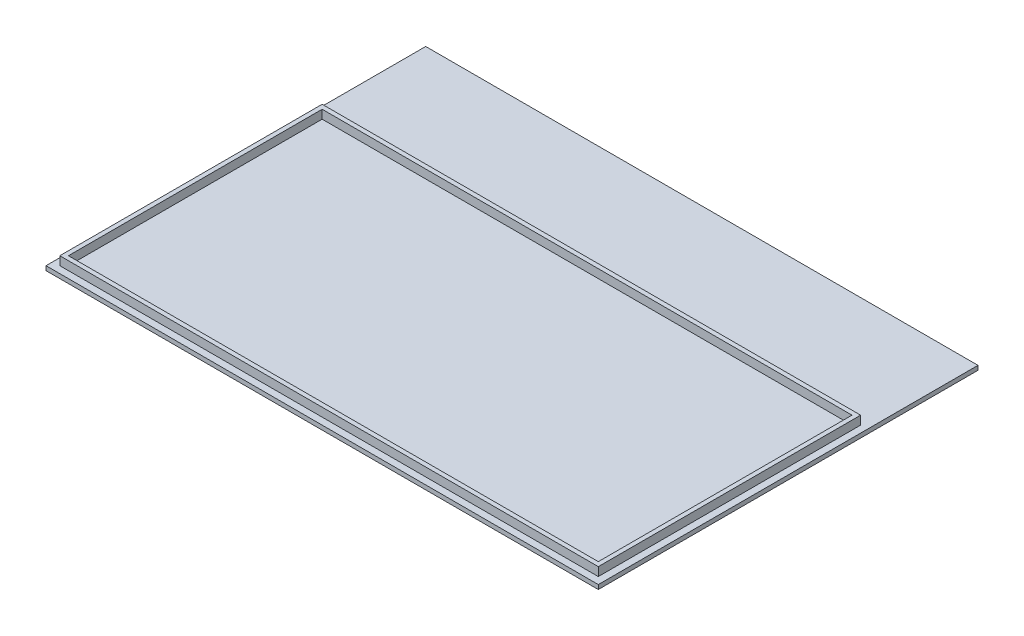
ISO-10303-21;
HEADER;
FILE_DESCRIPTION(('STEP AP214'),'2;1');
FILE_NAME('part.step','',(''),(''),'','','');
FILE_SCHEMA(('AUTOMOTIVE_DESIGN { 1 0 10303 214 1 1 1 1 }'));
ENDSEC;
DATA;
#1=APPLICATION_CONTEXT('core data for automotive mechanical design processes');
#2=APPLICATION_PROTOCOL_DEFINITION('international standard','automotive_design',2000,#1);
#3=PRODUCT_CONTEXT('',#1,'mechanical');
#4=PRODUCT('Part','Part','',(#3));
#5=PRODUCT_RELATED_PRODUCT_CATEGORY('part','',(#4));
#6=PRODUCT_DEFINITION_FORMATION('','',#4);
#7=PRODUCT_DEFINITION_CONTEXT('part definition',#1,'design');
#8=PRODUCT_DEFINITION('design','',#6,#7);
#9=PRODUCT_DEFINITION_SHAPE('','',#8);
#10=(LENGTH_UNIT() NAMED_UNIT(*) SI_UNIT(.MILLI.,.METRE.));
#11=(NAMED_UNIT(*) PLANE_ANGLE_UNIT() SI_UNIT($,.RADIAN.));
#12=(NAMED_UNIT(*) SI_UNIT($,.STERADIAN.) SOLID_ANGLE_UNIT());
#13=UNCERTAINTY_MEASURE_WITH_UNIT(LENGTH_MEASURE(1.E-05),#10,'distance_accuracy_value','');
#14=(GEOMETRIC_REPRESENTATION_CONTEXT(3) GLOBAL_UNCERTAINTY_ASSIGNED_CONTEXT((#13)) GLOBAL_UNIT_ASSIGNED_CONTEXT((#10,
#11,#12)) REPRESENTATION_CONTEXT('',''));
#15=CARTESIAN_POINT('',(0.,0.,0.));
#16=DIRECTION('',(0.,0.,1.));
#17=DIRECTION('',(1.,0.,0.));
#18=AXIS2_PLACEMENT_3D('',#15,#16,#17);
#19=CARTESIAN_POINT('',(0.,1.5875,0.));
#20=DIRECTION('',(0.,-1.,0.));
#21=DIRECTION('',(0.,0.,-1.));
#22=AXIS2_PLACEMENT_3D('',#19,#20,#21);
#23=PLANE('',#22);
#24=DIRECTION('',(0.,0.,-1.));
#25=VECTOR('',#24,1.);
#26=CARTESIAN_POINT('',(101.6,1.5875,50.8));
#27=LINE('',#26,#25);
#28=CARTESIAN_POINT('',(101.6,1.5875,50.8));
#29=VERTEX_POINT('',#28);
#30=CARTESIAN_POINT('',(101.6,1.5875,-88.9));
#31=VERTEX_POINT('',#30);
#32=EDGE_CURVE('E209',#29,#31,#27,.T.);
#33=ORIENTED_EDGE('',*,*,#32,.T.);
#34=DIRECTION('',(1.,0.,0.));
#35=VECTOR('',#34,1.);
#36=CARTESIAN_POINT('',(101.6,1.5875,-88.9));
#37=LINE('',#36,#35);
#38=CARTESIAN_POINT('',(-101.6,1.5875,-88.9));
#39=VERTEX_POINT('',#38);
#40=EDGE_CURVE('E145',#39,#31,#37,.T.);
#41=ORIENTED_EDGE('',*,*,#40,.F.);
#42=DIRECTION('',(0.,0.,1.));
#43=VECTOR('',#42,1.);
#44=CARTESIAN_POINT('',(-101.6,1.5875,50.8));
#45=LINE('',#44,#43);
#46=CARTESIAN_POINT('',(-101.6,1.5875,50.8));
#47=VERTEX_POINT('',#46);
#48=EDGE_CURVE('E211',#39,#47,#45,.T.);
#49=ORIENTED_EDGE('',*,*,#48,.T.);
#50=DIRECTION('',(1.,0.,0.));
#51=VECTOR('',#50,1.);
#52=CARTESIAN_POINT('',(-101.6,1.5875,50.8));
#53=LINE('',#52,#51);
#54=EDGE_CURVE('E214',#47,#29,#53,.T.);
#55=ORIENTED_EDGE('',*,*,#54,.T.);
#56=EDGE_LOOP('',(#33,#41,#49,#55));
#57=FACE_BOUND('',#56,.T.);
#58=DIRECTION('',(0.,0.,1.));
#59=VECTOR('',#58,1.);
#60=CARTESIAN_POINT('',(-99.06,1.5875,-48.26));
#61=LINE('',#60,#59);
#62=CARTESIAN_POINT('',(-99.06,1.5875,-48.26));
#63=VERTEX_POINT('',#62);
#64=CARTESIAN_POINT('',(-99.06,1.5875,48.26));
#65=VERTEX_POINT('',#64);
#66=EDGE_CURVE('E56',#63,#65,#61,.T.);
#67=ORIENTED_EDGE('',*,*,#66,.F.);
#68=DIRECTION('',(-1.,0.,0.));
#69=VECTOR('',#68,1.);
#70=CARTESIAN_POINT('',(-99.06,1.5875,-48.26));
#71=LINE('',#70,#69);
#72=CARTESIAN_POINT('',(99.06,1.5875,-48.26));
#73=VERTEX_POINT('',#72);
#74=EDGE_CURVE('E184',#73,#63,#71,.T.);
#75=ORIENTED_EDGE('',*,*,#74,.F.);
#76=DIRECTION('',(0.,0.,-1.));
#77=VECTOR('',#76,1.);
#78=CARTESIAN_POINT('',(99.06,1.5875,-48.26));
#79=LINE('',#78,#77);
#80=CARTESIAN_POINT('',(99.06,1.5875,48.26));
#81=VERTEX_POINT('',#80);
#82=EDGE_CURVE('E195',#81,#73,#79,.T.);
#83=ORIENTED_EDGE('',*,*,#82,.F.);
#84=DIRECTION('',(1.,0.,0.));
#85=VECTOR('',#84,1.);
#86=CARTESIAN_POINT('',(-99.06,1.5875,48.26));
#87=LINE('',#86,#85);
#88=EDGE_CURVE('E192',#65,#81,#87,.T.);
#89=ORIENTED_EDGE('',*,*,#88,.F.);
#90=EDGE_LOOP('',(#67,#75,#83,#89));
#91=FACE_BOUND('',#90,.T.);
#92=ADVANCED_FACE('F33',(#57,#91),#23,.F.);
#93=CARTESIAN_POINT('',(101.6,1.5875,50.8));
#94=DIRECTION('',(-1.,0.,0.));
#95=DIRECTION('',(0.,0.,1.));
#96=AXIS2_PLACEMENT_3D('',#93,#94,#95);
#97=PLANE('',#96);
#98=DIRECTION('',(0.,0.,-1.));
#99=VECTOR('',#98,1.);
#100=CARTESIAN_POINT('',(101.6,0.,50.8));
#101=LINE('',#100,#99);
#102=CARTESIAN_POINT('',(101.6,0.,50.8));
#103=VERTEX_POINT('',#102);
#104=CARTESIAN_POINT('',(101.6,0.,-88.9));
#105=VERTEX_POINT('',#104);
#106=EDGE_CURVE('E123',#103,#105,#101,.T.);
#107=ORIENTED_EDGE('',*,*,#106,.T.);
#108=DIRECTION('',(0.,-1.,0.));
#109=VECTOR('',#108,1.);
#110=CARTESIAN_POINT('',(101.6,1.5875,-88.9));
#111=LINE('',#110,#109);
#112=EDGE_CURVE('E127',#31,#105,#111,.T.);
#113=ORIENTED_EDGE('',*,*,#112,.F.);
#114=ORIENTED_EDGE('',*,*,#32,.F.);
#115=DIRECTION('',(0.,-1.,0.));
#116=VECTOR('',#115,1.);
#117=CARTESIAN_POINT('',(101.6,1.5875,50.8));
#118=LINE('',#117,#116);
#119=EDGE_CURVE('E41',#29,#103,#118,.T.);
#120=ORIENTED_EDGE('',*,*,#119,.T.);
#121=EDGE_LOOP('',(#107,#113,#114,#120));
#122=FACE_BOUND('',#121,.T.);
#123=ADVANCED_FACE('F35',(#122),#97,.F.);
#124=CARTESIAN_POINT('',(-101.6,1.5875,50.8));
#125=DIRECTION('',(1.,0.,0.));
#126=DIRECTION('',(0.,0.,-1.));
#127=AXIS2_PLACEMENT_3D('',#124,#125,#126);
#128=PLANE('',#127);
#129=DIRECTION('',(0.,0.,1.));
#130=VECTOR('',#129,1.);
#131=CARTESIAN_POINT('',(-101.6,0.,50.8));
#132=LINE('',#131,#130);
#133=CARTESIAN_POINT('',(-101.6,0.,-88.9));
#134=VERTEX_POINT('',#133);
#135=CARTESIAN_POINT('',(-101.6,0.,50.8));
#136=VERTEX_POINT('',#135);
#137=EDGE_CURVE('E131',#134,#136,#132,.T.);
#138=ORIENTED_EDGE('',*,*,#137,.T.);
#139=DIRECTION('',(0.,-1.,0.));
#140=VECTOR('',#139,1.);
#141=CARTESIAN_POINT('',(-101.6,1.5875,50.8));
#142=LINE('',#141,#140);
#143=EDGE_CURVE('E11',#47,#136,#142,.T.);
#144=ORIENTED_EDGE('',*,*,#143,.F.);
#145=ORIENTED_EDGE('',*,*,#48,.F.);
#146=DIRECTION('',(0.,1.,0.));
#147=VECTOR('',#146,1.);
#148=CARTESIAN_POINT('',(-101.6,1.5875,-88.9));
#149=LINE('',#148,#147);
#150=EDGE_CURVE('E140',#134,#39,#149,.T.);
#151=ORIENTED_EDGE('',*,*,#150,.F.);
#152=EDGE_LOOP('',(#138,#144,#145,#151));
#153=FACE_BOUND('',#152,.T.);
#154=ADVANCED_FACE('F222',(#153),#128,.F.);
#155=CARTESIAN_POINT('',(-101.6,1.5875,50.8));
#156=DIRECTION('',(0.,0.,-1.));
#157=DIRECTION('',(-1.,0.,0.));
#158=AXIS2_PLACEMENT_3D('',#155,#156,#157);
#159=PLANE('',#158);
#160=DIRECTION('',(1.,0.,0.));
#161=VECTOR('',#160,1.);
#162=CARTESIAN_POINT('',(-101.6,0.,50.8));
#163=LINE('',#162,#161);
#164=EDGE_CURVE('E212',#136,#103,#163,.T.);
#165=ORIENTED_EDGE('',*,*,#164,.T.);
#166=ORIENTED_EDGE('',*,*,#119,.F.);
#167=ORIENTED_EDGE('',*,*,#54,.F.);
#168=ORIENTED_EDGE('',*,*,#143,.T.);
#169=EDGE_LOOP('',(#165,#166,#167,#168));
#170=FACE_BOUND('',#169,.T.);
#171=ADVANCED_FACE('F218',(#170),#159,.F.);
#172=CARTESIAN_POINT('',(0.,0.,0.));
#173=DIRECTION('',(0.,-1.,0.));
#174=DIRECTION('',(0.,0.,-1.));
#175=AXIS2_PLACEMENT_3D('',#172,#173,#174);
#176=PLANE('',#175);
#177=ORIENTED_EDGE('',*,*,#106,.F.);
#178=ORIENTED_EDGE('',*,*,#164,.F.);
#179=ORIENTED_EDGE('',*,*,#137,.F.);
#180=DIRECTION('',(-1.,0.,0.));
#181=VECTOR('',#180,1.);
#182=CARTESIAN_POINT('',(101.6,0.,-88.9));
#183=LINE('',#182,#181);
#184=EDGE_CURVE('E135',#105,#134,#183,.T.);
#185=ORIENTED_EDGE('',*,*,#184,.F.);
#186=EDGE_LOOP('',(#177,#178,#179,#185));
#187=FACE_BOUND('',#186,.T.);
#188=ADVANCED_FACE('F136',(#187),#176,.T.);
#189=CARTESIAN_POINT('',(-99.06,4.7625,-48.26));
#190=DIRECTION('',(1.,0.,0.));
#191=DIRECTION('',(0.,0.,-1.));
#192=AXIS2_PLACEMENT_3D('',#189,#190,#191);
#193=PLANE('',#192);
#194=ORIENTED_EDGE('',*,*,#66,.T.);
#195=DIRECTION('',(0.,-1.,0.));
#196=VECTOR('',#195,1.);
#197=CARTESIAN_POINT('',(-99.06,4.7625,48.26));
#198=LINE('',#197,#196);
#199=CARTESIAN_POINT('',(-99.06,4.7625,48.26));
#200=VERTEX_POINT('',#199);
#201=EDGE_CURVE('E132',#200,#65,#198,.T.);
#202=ORIENTED_EDGE('',*,*,#201,.F.);
#203=DIRECTION('',(0.,0.,1.));
#204=VECTOR('',#203,1.);
#205=CARTESIAN_POINT('',(-99.06,4.7625,-48.26));
#206=LINE('',#205,#204);
#207=CARTESIAN_POINT('',(-99.06,4.7625,-48.26));
#208=VERTEX_POINT('',#207);
#209=EDGE_CURVE('E180',#208,#200,#206,.T.);
#210=ORIENTED_EDGE('',*,*,#209,.F.);
#211=DIRECTION('',(0.,-1.,0.));
#212=VECTOR('',#211,1.);
#213=CARTESIAN_POINT('',(-99.06,4.7625,-48.26));
#214=LINE('',#213,#212);
#215=EDGE_CURVE('E190',#208,#63,#214,.T.);
#216=ORIENTED_EDGE('',*,*,#215,.T.);
#217=EDGE_LOOP('',(#194,#202,#210,#216));
#218=FACE_BOUND('',#217,.T.);
#219=ADVANCED_FACE('F231',(#218),#193,.F.);
#220=CARTESIAN_POINT('',(-99.06,4.7625,48.26));
#221=DIRECTION('',(0.,0.,-1.));
#222=DIRECTION('',(-1.,0.,0.));
#223=AXIS2_PLACEMENT_3D('',#220,#221,#222);
#224=PLANE('',#223);
#225=ORIENTED_EDGE('',*,*,#88,.T.);
#226=DIRECTION('',(0.,-1.,0.));
#227=VECTOR('',#226,1.);
#228=CARTESIAN_POINT('',(99.06,4.7625,48.26));
#229=LINE('',#228,#227);
#230=CARTESIAN_POINT('',(99.06,4.7625,48.26));
#231=VERTEX_POINT('',#230);
#232=EDGE_CURVE('E204',#231,#81,#229,.T.);
#233=ORIENTED_EDGE('',*,*,#232,.F.);
#234=DIRECTION('',(1.,0.,0.));
#235=VECTOR('',#234,1.);
#236=CARTESIAN_POINT('',(-99.06,4.7625,48.26));
#237=LINE('',#236,#235);
#238=EDGE_CURVE('E183',#200,#231,#237,.T.);
#239=ORIENTED_EDGE('',*,*,#238,.F.);
#240=ORIENTED_EDGE('',*,*,#201,.T.);
#241=EDGE_LOOP('',(#225,#233,#239,#240));
#242=FACE_BOUND('',#241,.T.);
#243=ADVANCED_FACE('F256',(#242),#224,.F.);
#244=CARTESIAN_POINT('',(99.06,4.7625,-48.26));
#245=DIRECTION('',(-1.,0.,0.));
#246=DIRECTION('',(0.,0.,1.));
#247=AXIS2_PLACEMENT_3D('',#244,#245,#246);
#248=PLANE('',#247);
#249=ORIENTED_EDGE('',*,*,#82,.T.);
#250=DIRECTION('',(0.,-1.,0.));
#251=VECTOR('',#250,1.);
#252=CARTESIAN_POINT('',(99.06,4.7625,-48.26));
#253=LINE('',#252,#251);
#254=CARTESIAN_POINT('',(99.06,4.7625,-48.26));
#255=VERTEX_POINT('',#254);
#256=EDGE_CURVE('E201',#255,#73,#253,.T.);
#257=ORIENTED_EDGE('',*,*,#256,.F.);
#258=DIRECTION('',(0.,0.,-1.));
#259=VECTOR('',#258,1.);
#260=CARTESIAN_POINT('',(99.06,4.7625,-48.26));
#261=LINE('',#260,#259);
#262=EDGE_CURVE('E186',#231,#255,#261,.T.);
#263=ORIENTED_EDGE('',*,*,#262,.F.);
#264=ORIENTED_EDGE('',*,*,#232,.T.);
#265=EDGE_LOOP('',(#249,#257,#263,#264));
#266=FACE_BOUND('',#265,.T.);
#267=ADVANCED_FACE('F263',(#266),#248,.F.);
#268=CARTESIAN_POINT('',(-99.06,4.7625,-48.26));
#269=DIRECTION('',(0.,0.,1.));
#270=DIRECTION('',(1.,0.,0.));
#271=AXIS2_PLACEMENT_3D('',#268,#269,#270);
#272=PLANE('',#271);
#273=ORIENTED_EDGE('',*,*,#74,.T.);
#274=ORIENTED_EDGE('',*,*,#215,.F.);
#275=DIRECTION('',(-1.,0.,0.));
#276=VECTOR('',#275,1.);
#277=CARTESIAN_POINT('',(-99.06,4.7625,-48.26));
#278=LINE('',#277,#276);
#279=EDGE_CURVE('E188',#255,#208,#278,.T.);
#280=ORIENTED_EDGE('',*,*,#279,.F.);
#281=ORIENTED_EDGE('',*,*,#256,.T.);
#282=EDGE_LOOP('',(#273,#274,#280,#281));
#283=FACE_BOUND('',#282,.T.);
#284=ADVANCED_FACE('F270',(#283),#272,.F.);
#285=CARTESIAN_POINT('',(0.,4.7625,0.));
#286=DIRECTION('',(0.,1.,0.));
#287=DIRECTION('',(0.,0.,1.));
#288=AXIS2_PLACEMENT_3D('',#285,#286,#287);
#289=PLANE('',#288);
#290=DIRECTION('',(0.,0.,1.));
#291=VECTOR('',#290,1.);
#292=CARTESIAN_POINT('',(-97.4725,4.7625,-46.6725));
#293=LINE('',#292,#291);
#294=CARTESIAN_POINT('',(-97.4725,4.7625,-46.6725));
#295=VERTEX_POINT('',#294);
#296=CARTESIAN_POINT('',(-97.4725,4.7625,46.6725));
#297=VERTEX_POINT('',#296);
#298=EDGE_CURVE('E48',#295,#297,#293,.T.);
#299=ORIENTED_EDGE('',*,*,#298,.F.);
#300=DIRECTION('',(-1.,0.,0.));
#301=VECTOR('',#300,1.);
#302=CARTESIAN_POINT('',(-97.4725,4.7625,-46.6725));
#303=LINE('',#302,#301);
#304=CARTESIAN_POINT('',(97.4725,4.7625,-46.6725));
#305=VERTEX_POINT('',#304);
#306=EDGE_CURVE('E154',#305,#295,#303,.T.);
#307=ORIENTED_EDGE('',*,*,#306,.F.);
#308=DIRECTION('',(0.,0.,-1.));
#309=VECTOR('',#308,1.);
#310=CARTESIAN_POINT('',(97.4725,4.7625,-46.6725));
#311=LINE('',#310,#309);
#312=CARTESIAN_POINT('',(97.4725,4.7625,46.6725));
#313=VERTEX_POINT('',#312);
#314=EDGE_CURVE('E168',#313,#305,#311,.T.);
#315=ORIENTED_EDGE('',*,*,#314,.F.);
#316=DIRECTION('',(1.,0.,0.));
#317=VECTOR('',#316,1.);
#318=CARTESIAN_POINT('',(-97.4725,4.7625,46.6725));
#319=LINE('',#318,#317);
#320=EDGE_CURVE('E165',#297,#313,#319,.T.);
#321=ORIENTED_EDGE('',*,*,#320,.F.);
#322=EDGE_LOOP('',(#299,#307,#315,#321));
#323=FACE_BOUND('',#322,.T.);
#324=ORIENTED_EDGE('',*,*,#209,.T.);
#325=ORIENTED_EDGE('',*,*,#238,.T.);
#326=ORIENTED_EDGE('',*,*,#262,.T.);
#327=ORIENTED_EDGE('',*,*,#279,.T.);
#328=EDGE_LOOP('',(#324,#325,#326,#327));
#329=FACE_BOUND('',#328,.T.);
#330=ADVANCED_FACE('F278',(#323,#329),#289,.T.);
#331=CARTESIAN_POINT('',(-97.4725,1.5875,-46.6725));
#332=DIRECTION('',(-1.,0.,0.));
#333=DIRECTION('',(0.,0.,1.));
#334=AXIS2_PLACEMENT_3D('',#331,#332,#333);
#335=PLANE('',#334);
#336=ORIENTED_EDGE('',*,*,#298,.T.);
#337=DIRECTION('',(0.,1.,0.));
#338=VECTOR('',#337,1.);
#339=CARTESIAN_POINT('',(-97.4725,1.5875,46.6725));
#340=LINE('',#339,#338);
#341=CARTESIAN_POINT('',(-97.4725,1.5875,46.6725));
#342=VERTEX_POINT('',#341);
#343=EDGE_CURVE('E163',#342,#297,#340,.T.);
#344=ORIENTED_EDGE('',*,*,#343,.F.);
#345=DIRECTION('',(0.,0.,1.));
#346=VECTOR('',#345,1.);
#347=CARTESIAN_POINT('',(-97.4725,1.5875,-46.6725));
#348=LINE('',#347,#346);
#349=CARTESIAN_POINT('',(-97.4725,1.5875,-46.6725));
#350=VERTEX_POINT('',#349);
#351=EDGE_CURVE('E150',#350,#342,#348,.T.);
#352=ORIENTED_EDGE('',*,*,#351,.F.);
#353=DIRECTION('',(0.,1.,0.));
#354=VECTOR('',#353,1.);
#355=CARTESIAN_POINT('',(-97.4725,1.5875,-46.6725));
#356=LINE('',#355,#354);
#357=EDGE_CURVE('E173',#350,#295,#356,.T.);
#358=ORIENTED_EDGE('',*,*,#357,.T.);
#359=EDGE_LOOP('',(#336,#344,#352,#358));
#360=FACE_BOUND('',#359,.T.);
#361=ADVANCED_FACE('F286',(#360),#335,.F.);
#362=CARTESIAN_POINT('',(-97.4725,1.5875,-46.6725));
#363=DIRECTION('',(0.,0.,-1.));
#364=DIRECTION('',(-1.,0.,0.));
#365=AXIS2_PLACEMENT_3D('',#362,#363,#364);
#366=PLANE('',#365);
#367=ORIENTED_EDGE('',*,*,#306,.T.);
#368=ORIENTED_EDGE('',*,*,#357,.F.);
#369=DIRECTION('',(-1.,0.,0.));
#370=VECTOR('',#369,1.);
#371=CARTESIAN_POINT('',(-97.4725,1.5875,-46.6725));
#372=LINE('',#371,#370);
#373=CARTESIAN_POINT('',(97.4725,1.5875,-46.6725));
#374=VERTEX_POINT('',#373);
#375=EDGE_CURVE('E160',#374,#350,#372,.T.);
#376=ORIENTED_EDGE('',*,*,#375,.F.);
#377=DIRECTION('',(0.,1.,0.));
#378=VECTOR('',#377,1.);
#379=CARTESIAN_POINT('',(97.4725,1.5875,-46.6725));
#380=LINE('',#379,#378);
#381=EDGE_CURVE('E175',#374,#305,#380,.T.);
#382=ORIENTED_EDGE('',*,*,#381,.T.);
#383=EDGE_LOOP('',(#367,#368,#376,#382));
#384=FACE_BOUND('',#383,.T.);
#385=ADVANCED_FACE('F294',(#384),#366,.F.);
#386=CARTESIAN_POINT('',(97.4725,1.5875,-46.6725));
#387=DIRECTION('',(1.,0.,0.));
#388=DIRECTION('',(0.,0.,-1.));
#389=AXIS2_PLACEMENT_3D('',#386,#387,#388);
#390=PLANE('',#389);
#391=ORIENTED_EDGE('',*,*,#314,.T.);
#392=ORIENTED_EDGE('',*,*,#381,.F.);
#393=DIRECTION('',(0.,0.,-1.));
#394=VECTOR('',#393,1.);
#395=CARTESIAN_POINT('',(97.4725,1.5875,-46.6725));
#396=LINE('',#395,#394);
#397=CARTESIAN_POINT('',(97.4725,1.5875,46.6725));
#398=VERTEX_POINT('',#397);
#399=EDGE_CURVE('E157',#398,#374,#396,.T.);
#400=ORIENTED_EDGE('',*,*,#399,.F.);
#401=DIRECTION('',(0.,1.,0.));
#402=VECTOR('',#401,1.);
#403=CARTESIAN_POINT('',(97.4725,1.5875,46.6725));
#404=LINE('',#403,#402);
#405=EDGE_CURVE('E177',#398,#313,#404,.T.);
#406=ORIENTED_EDGE('',*,*,#405,.T.);
#407=EDGE_LOOP('',(#391,#392,#400,#406));
#408=FACE_BOUND('',#407,.T.);
#409=ADVANCED_FACE('F301',(#408),#390,.F.);
#410=CARTESIAN_POINT('',(-97.4725,1.5875,46.6725));
#411=DIRECTION('',(0.,0.,1.));
#412=DIRECTION('',(1.,0.,0.));
#413=AXIS2_PLACEMENT_3D('',#410,#411,#412);
#414=PLANE('',#413);
#415=ORIENTED_EDGE('',*,*,#320,.T.);
#416=ORIENTED_EDGE('',*,*,#405,.F.);
#417=DIRECTION('',(1.,0.,0.));
#418=VECTOR('',#417,1.);
#419=CARTESIAN_POINT('',(-97.4725,1.5875,46.6725));
#420=LINE('',#419,#418);
#421=EDGE_CURVE('E153',#342,#398,#420,.T.);
#422=ORIENTED_EDGE('',*,*,#421,.F.);
#423=ORIENTED_EDGE('',*,*,#343,.T.);
#424=EDGE_LOOP('',(#415,#416,#422,#423));
#425=FACE_BOUND('',#424,.T.);
#426=ADVANCED_FACE('F309',(#425),#414,.F.);
#427=CARTESIAN_POINT('',(0.,1.5875,0.));
#428=DIRECTION('',(0.,1.,0.));
#429=DIRECTION('',(0.,0.,1.));
#430=AXIS2_PLACEMENT_3D('',#427,#428,#429);
#431=PLANE('',#430);
#432=ORIENTED_EDGE('',*,*,#351,.T.);
#433=ORIENTED_EDGE('',*,*,#421,.T.);
#434=ORIENTED_EDGE('',*,*,#399,.T.);
#435=ORIENTED_EDGE('',*,*,#375,.T.);
#436=EDGE_LOOP('',(#432,#433,#434,#435));
#437=FACE_BOUND('',#436,.T.);
#438=ADVANCED_FACE('F317',(#437),#431,.T.);
#439=CARTESIAN_POINT('',(0.,0.,-88.9));
#440=DIRECTION('',(0.,0.,-1.));
#441=DIRECTION('',(-1.,0.,0.));
#442=AXIS2_PLACEMENT_3D('',#439,#440,#441);
#443=PLANE('',#442);
#444=ORIENTED_EDGE('',*,*,#112,.T.);
#445=ORIENTED_EDGE('',*,*,#184,.T.);
#446=ORIENTED_EDGE('',*,*,#150,.T.);
#447=ORIENTED_EDGE('',*,*,#40,.T.);
#448=EDGE_LOOP('',(#444,#445,#446,#447));
#449=FACE_BOUND('',#448,.T.);
#450=ADVANCED_FACE('F143',(#449),#443,.T.);
#451=CLOSED_SHELL('',(#92,#123,#154,#171,#188,#219,#243,#267,#284,#330,#361,#385,#409,#426,#438,#450));
#452=MANIFOLD_SOLID_BREP('B2',#451);
#453=ADVANCED_BREP_SHAPE_REPRESENTATION('',(#18,#452),#14);
#454=SHAPE_DEFINITION_REPRESENTATION(#9,#453);
ENDSEC;
END-ISO-10303-21;
